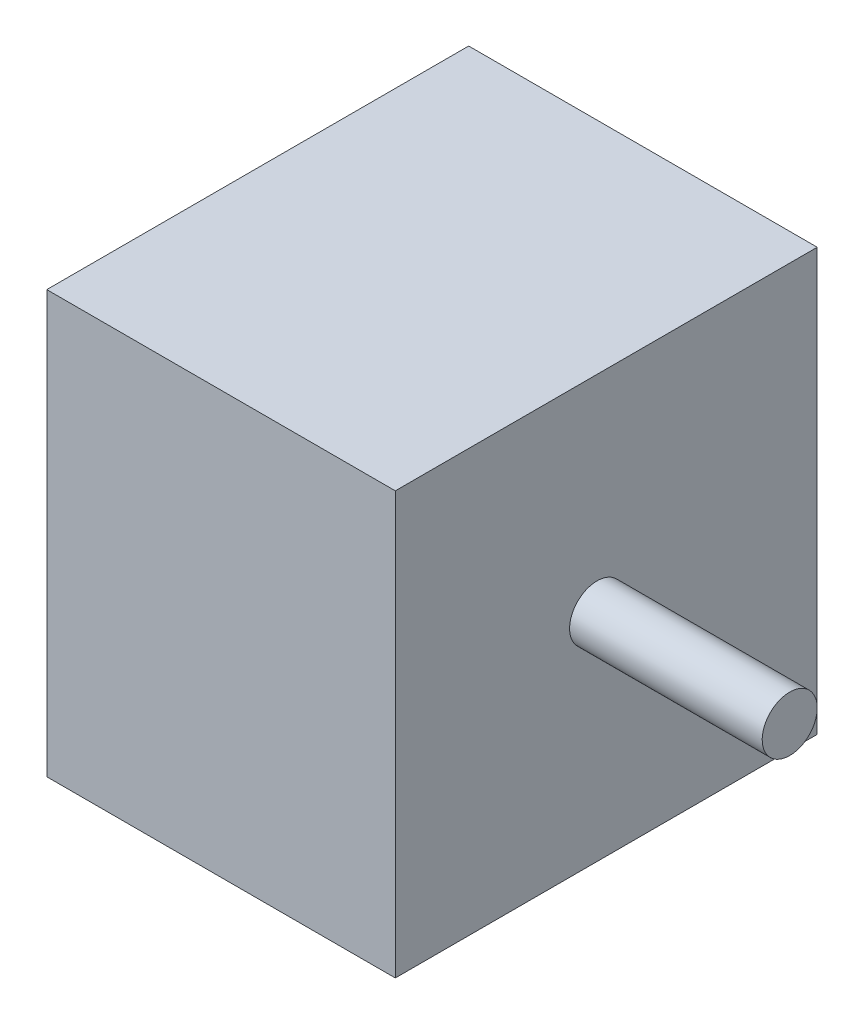
ISO-10303-21;
HEADER;
FILE_DESCRIPTION(('STEP AP214'),'2;1');
FILE_NAME('part.step','',(''),(''),'','','');
FILE_SCHEMA(('AUTOMOTIVE_DESIGN { 1 0 10303 214 1 1 1 1 }'));
ENDSEC;
DATA;
#1=APPLICATION_CONTEXT('core data for automotive mechanical design processes');
#2=APPLICATION_PROTOCOL_DEFINITION('international standard','automotive_design',2000,#1);
#3=PRODUCT_CONTEXT('',#1,'mechanical');
#4=PRODUCT('Part','Part','',(#3));
#5=PRODUCT_RELATED_PRODUCT_CATEGORY('part','',(#4));
#6=PRODUCT_DEFINITION_FORMATION('','',#4);
#7=PRODUCT_DEFINITION_CONTEXT('part definition',#1,'design');
#8=PRODUCT_DEFINITION('design','',#6,#7);
#9=PRODUCT_DEFINITION_SHAPE('','',#8);
#10=(LENGTH_UNIT() NAMED_UNIT(*) SI_UNIT(.MILLI.,.METRE.));
#11=(NAMED_UNIT(*) PLANE_ANGLE_UNIT() SI_UNIT($,.RADIAN.));
#12=(NAMED_UNIT(*) SI_UNIT($,.STERADIAN.) SOLID_ANGLE_UNIT());
#13=UNCERTAINTY_MEASURE_WITH_UNIT(LENGTH_MEASURE(1.E-05),#10,'distance_accuracy_value','');
#14=(GEOMETRIC_REPRESENTATION_CONTEXT(3) GLOBAL_UNCERTAINTY_ASSIGNED_CONTEXT((#13)) GLOBAL_UNIT_ASSIGNED_CONTEXT((#10,
#11,#12)) REPRESENTATION_CONTEXT('',''));
#15=CARTESIAN_POINT('',(0.,0.,0.));
#16=DIRECTION('',(0.,0.,1.));
#17=DIRECTION('',(1.,0.,0.));
#18=AXIS2_PLACEMENT_3D('',#15,#16,#17);
#19=CARTESIAN_POINT('',(-15.9,198.903184518172,52.2));
#20=DIRECTION('',(-1.,0.,0.));
#21=DIRECTION('',(0.,0.,1.));
#22=AXIS2_PLACEMENT_3D('',#19,#20,#21);
#23=PLANE('',#22);
#24=DIRECTION('',(0.,-1.,0.));
#25=VECTOR('',#24,1.);
#26=CARTESIAN_POINT('',(-15.9,188.847401986937,3.1));
#27=LINE('',#26,#25);
#28=CARTESIAN_POINT('',(-15.9,26.1,3.1));
#29=VERTEX_POINT('',#28);
#30=CARTESIAN_POINT('',(-15.9,-19.9,3.1));
#31=VERTEX_POINT('',#30);
#32=EDGE_CURVE('E82',#29,#31,#27,.T.);
#33=ORIENTED_EDGE('',*,*,#32,.T.);
#34=DIRECTION('',(0.,0.,1.));
#35=VECTOR('',#34,1.);
#36=CARTESIAN_POINT('',(-15.9,-19.9,52.2));
#37=LINE('',#36,#35);
#38=CARTESIAN_POINT('',(-15.9,-19.9,49.1));
#39=VERTEX_POINT('',#38);
#40=EDGE_CURVE('E48',#31,#39,#37,.T.);
#41=ORIENTED_EDGE('',*,*,#40,.T.);
#42=DIRECTION('',(0.,-1.,0.));
#43=VECTOR('',#42,1.);
#44=CARTESIAN_POINT('',(-15.9,198.903184518172,49.1));
#45=LINE('',#44,#43);
#46=CARTESIAN_POINT('',(-15.9,26.1,49.1));
#47=VERTEX_POINT('',#46);
#48=EDGE_CURVE('E100',#47,#39,#45,.T.);
#49=ORIENTED_EDGE('',*,*,#48,.F.);
#50=DIRECTION('',(0.,0.,1.));
#51=VECTOR('',#50,1.);
#52=CARTESIAN_POINT('',(-15.9,26.1,52.2));
#53=LINE('',#52,#51);
#54=EDGE_CURVE('E96',#29,#47,#53,.T.);
#55=ORIENTED_EDGE('',*,*,#54,.F.);
#56=EDGE_LOOP('',(#33,#41,#49,#55));
#57=FACE_BOUND('',#56,.T.);
#58=ADVANCED_FACE('F33',(#57),#23,.T.);
#59=CARTESIAN_POINT('',(-22.1,26.1,52.2));
#60=DIRECTION('',(0.,-1.,0.));
#61=DIRECTION('',(0.,0.,-1.));
#62=AXIS2_PLACEMENT_3D('',#59,#60,#61);
#63=PLANE('',#62);
#64=DIRECTION('',(1.,0.,0.));
#65=VECTOR('',#64,1.);
#66=CARTESIAN_POINT('',(22.1,26.1,3.1));
#67=LINE('',#66,#65);
#68=CARTESIAN_POINT('',(22.1,26.1,3.1));
#69=VERTEX_POINT('',#68);
#70=EDGE_CURVE('E77',#29,#69,#67,.T.);
#71=ORIENTED_EDGE('',*,*,#70,.F.);
#72=ORIENTED_EDGE('',*,*,#54,.T.);
#73=DIRECTION('',(1.,0.,0.));
#74=VECTOR('',#73,1.);
#75=CARTESIAN_POINT('',(22.1,26.1,49.1));
#76=LINE('',#75,#74);
#77=CARTESIAN_POINT('',(22.1,26.1,49.1));
#78=VERTEX_POINT('',#77);
#79=EDGE_CURVE('E90',#47,#78,#76,.T.);
#80=ORIENTED_EDGE('',*,*,#79,.T.);
#81=DIRECTION('',(0.,0.,-1.));
#82=VECTOR('',#81,1.);
#83=CARTESIAN_POINT('',(22.1,26.1,52.2));
#84=LINE('',#83,#82);
#85=EDGE_CURVE('E41',#78,#69,#84,.T.);
#86=ORIENTED_EDGE('',*,*,#85,.T.);
#87=EDGE_LOOP('',(#71,#72,#80,#86));
#88=FACE_BOUND('',#87,.T.);
#89=ADVANCED_FACE('F92',(#88),#63,.F.);
#90=CARTESIAN_POINT('',(22.1,26.1,52.2));
#91=DIRECTION('',(-1.,0.,0.));
#92=DIRECTION('',(0.,-1.,0.));
#93=AXIS2_PLACEMENT_3D('',#90,#91,#92);
#94=PLANE('',#93);
#95=CARTESIAN_POINT('',(22.1,3.6,27.1));
#96=DIRECTION('',(-1.,0.,0.));
#97=DIRECTION('',(0.,-1.,0.));
#98=AXIS2_PLACEMENT_3D('',#95,#96,#97);
#99=CIRCLE('',#98,3.);
#100=CARTESIAN_POINT('',(22.1,0.599999999999995,27.1));
#101=VERTEX_POINT('',#100);
#102=EDGE_CURVE('E11',#101,#101,#99,.F.);
#103=ORIENTED_EDGE('',*,*,#102,.F.);
#104=EDGE_LOOP('',(#103));
#105=FACE_BOUND('',#104,.T.);
#106=DIRECTION('',(0.,0.,1.));
#107=VECTOR('',#106,1.);
#108=CARTESIAN_POINT('',(22.1,-19.9,52.2));
#109=LINE('',#108,#107);
#110=CARTESIAN_POINT('',(22.1,-19.9,3.1));
#111=VERTEX_POINT('',#110);
#112=CARTESIAN_POINT('',(22.1,-19.9,49.1));
#113=VERTEX_POINT('',#112);
#114=EDGE_CURVE('E89',#111,#113,#109,.T.);
#115=ORIENTED_EDGE('',*,*,#114,.F.);
#116=DIRECTION('',(0.,-1.,0.));
#117=VECTOR('',#116,1.);
#118=CARTESIAN_POINT('',(22.1,188.847401986937,3.1));
#119=LINE('',#118,#117);
#120=EDGE_CURVE('E80',#69,#111,#119,.T.);
#121=ORIENTED_EDGE('',*,*,#120,.F.);
#122=ORIENTED_EDGE('',*,*,#85,.F.);
#123=DIRECTION('',(0.,-1.,0.));
#124=VECTOR('',#123,1.);
#125=CARTESIAN_POINT('',(22.1,198.903184518172,49.1));
#126=LINE('',#125,#124);
#127=EDGE_CURVE('E56',#78,#113,#126,.T.);
#128=ORIENTED_EDGE('',*,*,#127,.T.);
#129=EDGE_LOOP('',(#115,#121,#122,#128));
#130=FACE_BOUND('',#129,.T.);
#131=ADVANCED_FACE('F35',(#105,#130),#94,.F.);
#132=CARTESIAN_POINT('',(129.653184518172,-19.9,52.2));
#133=DIRECTION('',(0.,1.,0.));
#134=DIRECTION('',(-1.,0.,0.));
#135=AXIS2_PLACEMENT_3D('',#132,#133,#134);
#136=PLANE('',#135);
#137=DIRECTION('',(1.,0.,0.));
#138=VECTOR('',#137,1.);
#139=CARTESIAN_POINT('',(22.1,-19.9,49.1));
#140=LINE('',#139,#138);
#141=EDGE_CURVE('E103',#39,#113,#140,.T.);
#142=ORIENTED_EDGE('',*,*,#141,.F.);
#143=ORIENTED_EDGE('',*,*,#40,.F.);
#144=DIRECTION('',(1.,0.,0.));
#145=VECTOR('',#144,1.);
#146=CARTESIAN_POINT('',(22.1,-19.9,3.1));
#147=LINE('',#146,#145);
#148=EDGE_CURVE('E86',#31,#111,#147,.T.);
#149=ORIENTED_EDGE('',*,*,#148,.T.);
#150=ORIENTED_EDGE('',*,*,#114,.T.);
#151=EDGE_LOOP('',(#142,#143,#149,#150));
#152=FACE_BOUND('',#151,.T.);
#153=ADVANCED_FACE('F121',(#152),#136,.F.);
#154=CARTESIAN_POINT('',(22.1,198.903184518172,49.1));
#155=DIRECTION('',(0.,0.,1.));
#156=DIRECTION('',(1.,0.,0.));
#157=AXIS2_PLACEMENT_3D('',#154,#155,#156);
#158=PLANE('',#157);
#159=ORIENTED_EDGE('',*,*,#79,.F.);
#160=ORIENTED_EDGE('',*,*,#48,.T.);
#161=ORIENTED_EDGE('',*,*,#141,.T.);
#162=ORIENTED_EDGE('',*,*,#127,.F.);
#163=EDGE_LOOP('',(#159,#160,#161,#162));
#164=FACE_BOUND('',#163,.T.);
#165=ADVANCED_FACE('F126',(#164),#158,.T.);
#166=CARTESIAN_POINT('',(22.1,188.847401986937,3.1));
#167=DIRECTION('',(0.,0.,1.));
#168=DIRECTION('',(1.,0.,0.));
#169=AXIS2_PLACEMENT_3D('',#166,#167,#168);
#170=PLANE('',#169);
#171=ORIENTED_EDGE('',*,*,#70,.T.);
#172=ORIENTED_EDGE('',*,*,#120,.T.);
#173=ORIENTED_EDGE('',*,*,#148,.F.);
#174=ORIENTED_EDGE('',*,*,#32,.F.);
#175=EDGE_LOOP('',(#171,#172,#173,#174));
#176=FACE_BOUND('',#175,.T.);
#177=ADVANCED_FACE('F79',(#176),#170,.F.);
#178=CARTESIAN_POINT('',(43.1,3.6,27.1));
#179=DIRECTION('',(-1.,0.,0.));
#180=DIRECTION('',(0.,-1.,0.));
#181=AXIS2_PLACEMENT_3D('',#178,#179,#180);
#182=CYLINDRICAL_SURFACE('',#181,3.);
#183=CARTESIAN_POINT('',(43.1,3.6,27.1));
#184=DIRECTION('',(1.,0.,0.));
#185=DIRECTION('',(0.,1.,0.));
#186=AXIS2_PLACEMENT_3D('',#183,#184,#185);
#187=CIRCLE('',#186,3.);
#188=CARTESIAN_POINT('',(43.1,0.599999999999999,27.1));
#189=VERTEX_POINT('',#188);
#190=EDGE_CURVE('E87',#189,#189,#187,.T.);
#191=CARTESIAN_POINT('',(43.1,0.599999999999999,27.1));
#192=CARTESIAN_POINT('',(42.88125,0.599999999999999,27.1));
#193=CARTESIAN_POINT('',(42.6625,0.599999999999999,27.1));
#194=CARTESIAN_POINT('',(42.225,0.599999999999999,27.1));
#195=CARTESIAN_POINT('',(42.00625,0.599999999999999,27.1));
#196=CARTESIAN_POINT('',(41.56875,0.599999999999999,27.1));
#197=CARTESIAN_POINT('',(41.35,0.599999999999999,27.1));
#198=CARTESIAN_POINT('',(40.9125,0.599999999999999,27.1));
#199=CARTESIAN_POINT('',(40.69375,0.599999999999999,27.1));
#200=CARTESIAN_POINT('',(40.25625,0.599999999999999,27.1));
#201=CARTESIAN_POINT('',(40.0375,0.599999999999999,27.1));
#202=CARTESIAN_POINT('',(39.6,0.599999999999999,27.1));
#203=CARTESIAN_POINT('',(39.38125,0.599999999999999,27.1));
#204=CARTESIAN_POINT('',(38.94375,0.599999999999999,27.1));
#205=CARTESIAN_POINT('',(38.725,0.599999999999999,27.1));
#206=CARTESIAN_POINT('',(38.2875,0.599999999999998,27.1));
#207=CARTESIAN_POINT('',(38.06875,0.599999999999998,27.1));
#208=CARTESIAN_POINT('',(37.63125,0.599999999999998,27.1));
#209=CARTESIAN_POINT('',(37.4125,0.599999999999998,27.1));
#210=CARTESIAN_POINT('',(36.975,0.599999999999998,27.1));
#211=CARTESIAN_POINT('',(36.75625,0.599999999999998,27.1));
#212=CARTESIAN_POINT('',(36.31875,0.599999999999998,27.1));
#213=CARTESIAN_POINT('',(36.1,0.599999999999998,27.1));
#214=CARTESIAN_POINT('',(35.6625,0.599999999999998,27.1));
#215=CARTESIAN_POINT('',(35.44375,0.599999999999998,27.1));
#216=CARTESIAN_POINT('',(35.00625,0.599999999999998,27.1));
#217=CARTESIAN_POINT('',(34.7875,0.599999999999998,27.1));
#218=CARTESIAN_POINT('',(34.35,0.599999999999998,27.1));
#219=CARTESIAN_POINT('',(34.13125,0.599999999999998,27.1));
#220=CARTESIAN_POINT('',(33.69375,0.599999999999998,27.1));
#221=CARTESIAN_POINT('',(33.475,0.599999999999997,27.1));
#222=CARTESIAN_POINT('',(33.0375,0.599999999999997,27.1));
#223=CARTESIAN_POINT('',(32.81875,0.599999999999997,27.1));
#224=CARTESIAN_POINT('',(32.38125,0.599999999999997,27.1));
#225=CARTESIAN_POINT('',(32.1625,0.599999999999997,27.1));
#226=CARTESIAN_POINT('',(31.725,0.599999999999997,27.1));
#227=CARTESIAN_POINT('',(31.50625,0.599999999999997,27.1));
#228=CARTESIAN_POINT('',(31.06875,0.599999999999997,27.1));
#229=CARTESIAN_POINT('',(30.85,0.599999999999997,27.1));
#230=CARTESIAN_POINT('',(30.4125,0.599999999999997,27.1));
#231=CARTESIAN_POINT('',(30.19375,0.599999999999997,27.1));
#232=CARTESIAN_POINT('',(29.75625,0.599999999999997,27.1));
#233=CARTESIAN_POINT('',(29.5375,0.599999999999997,27.1));
#234=CARTESIAN_POINT('',(29.1,0.599999999999997,27.1));
#235=CARTESIAN_POINT('',(28.88125,0.599999999999997,27.1));
#236=CARTESIAN_POINT('',(28.44375,0.599999999999996,27.1));
#237=CARTESIAN_POINT('',(28.225,0.599999999999996,27.1));
#238=CARTESIAN_POINT('',(27.7875,0.599999999999996,27.1));
#239=CARTESIAN_POINT('',(27.56875,0.599999999999996,27.1));
#240=CARTESIAN_POINT('',(27.13125,0.599999999999996,27.1));
#241=CARTESIAN_POINT('',(26.9125,0.599999999999996,27.1));
#242=CARTESIAN_POINT('',(26.475,0.599999999999996,27.1));
#243=CARTESIAN_POINT('',(26.25625,0.599999999999996,27.1));
#244=CARTESIAN_POINT('',(25.81875,0.599999999999996,27.1));
#245=CARTESIAN_POINT('',(25.6,0.599999999999996,27.1));
#246=CARTESIAN_POINT('',(25.1625,0.599999999999996,27.1));
#247=CARTESIAN_POINT('',(24.94375,0.599999999999996,27.1));
#248=CARTESIAN_POINT('',(24.50625,0.599999999999996,27.1));
#249=CARTESIAN_POINT('',(24.2875,0.599999999999996,27.1));
#250=CARTESIAN_POINT('',(23.85,0.599999999999996,27.1));
#251=CARTESIAN_POINT('',(23.63125,0.599999999999996,27.1));
#252=CARTESIAN_POINT('',(23.19375,0.599999999999996,27.1));
#253=CARTESIAN_POINT('',(22.975,0.599999999999995,27.1));
#254=CARTESIAN_POINT('',(22.5375,0.599999999999995,27.1));
#255=CARTESIAN_POINT('',(22.31875,0.599999999999995,27.1));
#256=CARTESIAN_POINT('',(22.1,0.599999999999995,27.1));
#257=B_SPLINE_CURVE_WITH_KNOTS('',3,(#191,#192,#193,#194,#195,#196,#197,#198,#199,#200,#201,
#202,#203,#204,#205,#206,#207,#208,#209,#210,#211,#212,#213,#214,#215,#216,#217,#218,#219,#220,
#221,#222,#223,#224,#225,#226,#227,#228,#229,#230,#231,#232,#233,#234,#235,#236,#237,#238,#239,
#240,#241,#242,#243,#244,#245,#246,#247,#248,#249,#250,#251,#252,#253,#254,#255,#256),
.UNSPECIFIED.,.F.,.F.,(4,2,2,2,2,2,2,2,2,2,2,2,2,2,2,2,2,2,2,2,2,2,2,2,2,2,2,2,2,2,2,2,4),(0.,
0.656250000000004,1.3125,1.96875000000001,2.625,3.28125000000001,3.9375,4.59375000000001,5.25,
5.90625,6.56250000000001,7.21875,7.87500000000001,8.53125,9.1875,9.84375000000001,10.5,11.15625,
11.8125,12.46875,13.125,13.78125,14.4375,15.09375,15.75,16.40625,17.0625,17.71875,18.375,
19.03125,19.6875,20.34375,21.),.UNSPECIFIED.);
#258=EDGE_CURVE('BSEAM114',#189,#101,#257,.T.);
#259=ORIENTED_EDGE('',*,*,#190,.F.);
#260=ORIENTED_EDGE('',*,*,#102,.T.);
#261=ORIENTED_EDGE('',*,*,#258,.T.);
#262=ORIENTED_EDGE('',*,*,#258,.F.);
#263=EDGE_LOOP('',(#259,#261,#260,#262));
#264=FACE_BOUND('',#263,.T.);
#265=ADVANCED_FACE('F114',(#264),#182,.T.);
#266=CARTESIAN_POINT('',(43.1,3.6,27.1));
#267=DIRECTION('',(1.,0.,0.));
#268=DIRECTION('',(0.,1.,0.));
#269=AXIS2_PLACEMENT_3D('',#266,#267,#268);
#270=PLANE('',#269);
#271=ORIENTED_EDGE('',*,*,#190,.T.);
#272=EDGE_LOOP('',(#271));
#273=FACE_BOUND('',#272,.T.);
#274=ADVANCED_FACE('F112',(#273),#270,.T.);
#275=CLOSED_SHELL('',(#58,#89,#131,#153,#165,#177,#265,#274));
#276=MANIFOLD_SOLID_BREP('B2',#275);
#277=ADVANCED_BREP_SHAPE_REPRESENTATION('',(#18,#276),#14);
#278=SHAPE_DEFINITION_REPRESENTATION(#9,#277);
ENDSEC;
END-ISO-10303-21;
